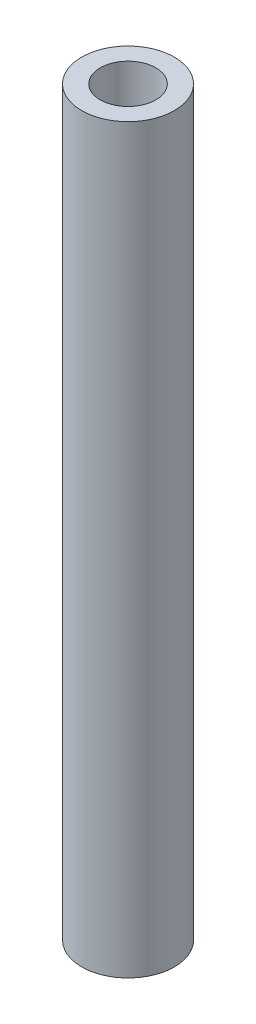
ISO-10303-21;
HEADER;
FILE_DESCRIPTION(('STEP AP214'),'2;1');
FILE_NAME('part.step','',(''),(''),'','','');
FILE_SCHEMA(('AUTOMOTIVE_DESIGN { 1 0 10303 214 1 1 1 1 }'));
ENDSEC;
DATA;
#1=APPLICATION_CONTEXT('core data for automotive mechanical design processes');
#2=APPLICATION_PROTOCOL_DEFINITION('international standard','automotive_design',2000,#1);
#3=PRODUCT_CONTEXT('',#1,'mechanical');
#4=PRODUCT('Part','Part','',(#3));
#5=PRODUCT_RELATED_PRODUCT_CATEGORY('part','',(#4));
#6=PRODUCT_DEFINITION_FORMATION('','',#4);
#7=PRODUCT_DEFINITION_CONTEXT('part definition',#1,'design');
#8=PRODUCT_DEFINITION('design','',#6,#7);
#9=PRODUCT_DEFINITION_SHAPE('','',#8);
#10=(LENGTH_UNIT() NAMED_UNIT(*) SI_UNIT(.MILLI.,.METRE.));
#11=(NAMED_UNIT(*) PLANE_ANGLE_UNIT() SI_UNIT($,.RADIAN.));
#12=(NAMED_UNIT(*) SI_UNIT($,.STERADIAN.) SOLID_ANGLE_UNIT());
#13=UNCERTAINTY_MEASURE_WITH_UNIT(LENGTH_MEASURE(1.E-05),#10,'distance_accuracy_value','');
#14=(GEOMETRIC_REPRESENTATION_CONTEXT(3) GLOBAL_UNCERTAINTY_ASSIGNED_CONTEXT((#13)) GLOBAL_UNIT_ASSIGNED_CONTEXT((#10,
#11,#12)) REPRESENTATION_CONTEXT('',''));
#15=CARTESIAN_POINT('',(0.,0.,0.));
#16=DIRECTION('',(0.,0.,1.));
#17=DIRECTION('',(1.,0.,0.));
#18=AXIS2_PLACEMENT_3D('',#15,#16,#17);
#19=CARTESIAN_POINT('',(0.,40.,0.));
#20=DIRECTION('',(0.,1.,0.));
#21=DIRECTION('',(0.,0.,1.));
#22=AXIS2_PLACEMENT_3D('',#19,#20,#21);
#23=PLANE('',#22);
#24=CARTESIAN_POINT('',(0.,40.,0.));
#25=DIRECTION('',(0.,1.,0.));
#26=DIRECTION('',(1.,0.,0.));
#27=AXIS2_PLACEMENT_3D('',#24,#25,#26);
#28=CIRCLE('',#27,2.5);
#29=CARTESIAN_POINT('',(2.5,40.,0.));
#30=VERTEX_POINT('',#29);
#31=EDGE_CURVE('E11',#30,#30,#28,.T.);
#32=ORIENTED_EDGE('',*,*,#31,.T.);
#33=EDGE_LOOP('',(#32));
#34=FACE_BOUND('',#33,.T.);
#35=CARTESIAN_POINT('',(0.,40.,0.));
#36=DIRECTION('',(0.,1.,0.));
#37=DIRECTION('',(0.,0.,1.));
#38=AXIS2_PLACEMENT_3D('',#35,#36,#37);
#39=CIRCLE('',#38,1.5);
#40=CARTESIAN_POINT('',(0.,40.,1.5));
#41=VERTEX_POINT('',#40);
#42=EDGE_CURVE('E50',#41,#41,#39,.T.);
#43=ORIENTED_EDGE('',*,*,#42,.F.);
#44=EDGE_LOOP('',(#43));
#45=FACE_BOUND('',#44,.T.);
#46=ADVANCED_FACE('F39',(#34,#45),#23,.T.);
#47=CARTESIAN_POINT('',(0.,0.,0.));
#48=DIRECTION('',(0.,1.,0.));
#49=DIRECTION('',(0.,0.,1.));
#50=AXIS2_PLACEMENT_3D('',#47,#48,#49);
#51=PLANE('',#50);
#52=CARTESIAN_POINT('',(0.,0.,0.));
#53=DIRECTION('',(0.,1.,0.));
#54=DIRECTION('',(1.,0.,0.));
#55=AXIS2_PLACEMENT_3D('',#52,#53,#54);
#56=CIRCLE('',#55,2.5);
#57=CARTESIAN_POINT('',(2.5,0.,0.));
#58=VERTEX_POINT('',#57);
#59=EDGE_CURVE('E43',#58,#58,#56,.T.);
#60=ORIENTED_EDGE('',*,*,#59,.F.);
#61=EDGE_LOOP('',(#60));
#62=FACE_BOUND('',#61,.T.);
#63=CARTESIAN_POINT('',(0.,0.,0.));
#64=DIRECTION('',(0.,1.,0.));
#65=DIRECTION('',(0.,0.,1.));
#66=AXIS2_PLACEMENT_3D('',#63,#64,#65);
#67=CIRCLE('',#66,1.5);
#68=CARTESIAN_POINT('',(0.,0.,1.5));
#69=VERTEX_POINT('',#68);
#70=EDGE_CURVE('E52',#69,#69,#67,.T.);
#71=ORIENTED_EDGE('',*,*,#70,.T.);
#72=EDGE_LOOP('',(#71));
#73=FACE_BOUND('',#72,.T.);
#74=ADVANCED_FACE('F62',(#62,#73),#51,.F.);
#75=CARTESIAN_POINT('',(0.,40.,0.));
#76=DIRECTION('',(0.,-1.,0.));
#77=DIRECTION('',(0.,0.,-1.));
#78=AXIS2_PLACEMENT_3D('',#75,#76,#77);
#79=CYLINDRICAL_SURFACE('',#78,2.5);
#80=ORIENTED_EDGE('',*,*,#31,.F.);
#81=EDGE_LOOP('',(#80));
#82=FACE_BOUND('',#81,.T.);
#83=ORIENTED_EDGE('',*,*,#59,.T.);
#84=EDGE_LOOP('',(#83));
#85=FACE_BOUND('',#84,.T.);
#86=ADVANCED_FACE('F41',(#82,#85),#79,.T.);
#87=CARTESIAN_POINT('',(0.,40.,0.));
#88=DIRECTION('',(0.,-1.,0.));
#89=DIRECTION('',(0.,0.,-1.));
#90=AXIS2_PLACEMENT_3D('',#87,#88,#89);
#91=CYLINDRICAL_SURFACE('',#90,1.5);
#92=ORIENTED_EDGE('',*,*,#42,.T.);
#93=EDGE_LOOP('',(#92));
#94=FACE_BOUND('',#93,.T.);
#95=ORIENTED_EDGE('',*,*,#70,.F.);
#96=EDGE_LOOP('',(#95));
#97=FACE_BOUND('',#96,.T.);
#98=ADVANCED_FACE('F58',(#94,#97),#91,.F.);
#99=CLOSED_SHELL('',(#46,#74,#86,#98));
#100=MANIFOLD_SOLID_BREP('B2',#99);
#101=ADVANCED_BREP_SHAPE_REPRESENTATION('',(#18,#100),#14);
#102=SHAPE_DEFINITION_REPRESENTATION(#9,#101);
ENDSEC;
END-ISO-10303-21;
